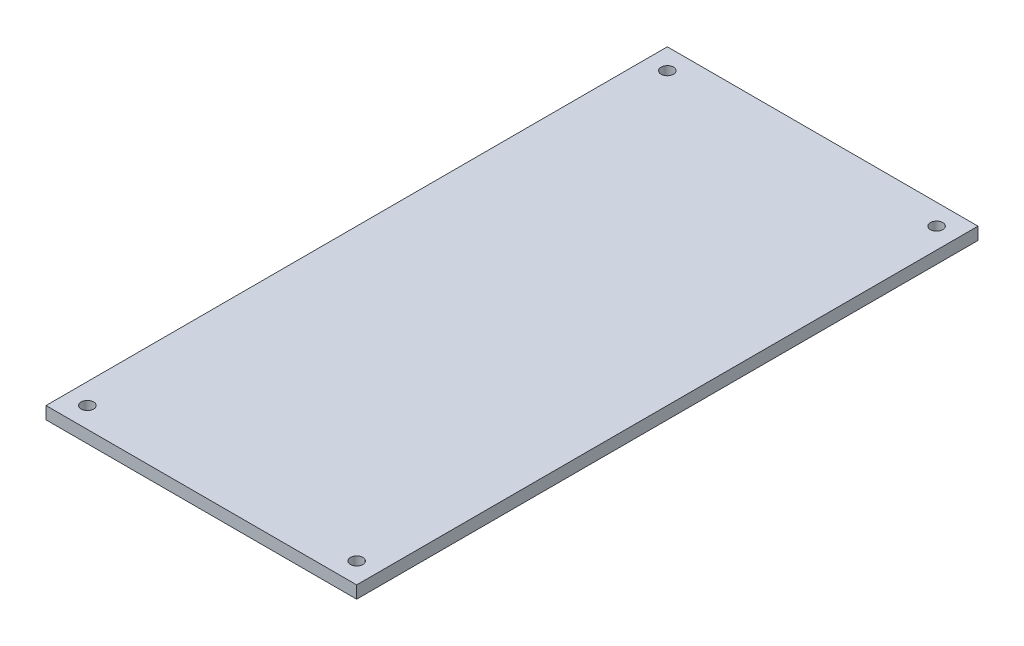
ISO-10303-21;
HEADER;
FILE_DESCRIPTION(('STEP AP214'),'2;1');
FILE_NAME('part.step','',(''),(''),'','','');
FILE_SCHEMA(('AUTOMOTIVE_DESIGN { 1 0 10303 214 1 1 1 1 }'));
ENDSEC;
DATA;
#1=APPLICATION_CONTEXT('core data for automotive mechanical design processes');
#2=APPLICATION_PROTOCOL_DEFINITION('international standard','automotive_design',2000,#1);
#3=PRODUCT_CONTEXT('',#1,'mechanical');
#4=PRODUCT('Part','Part','',(#3));
#5=PRODUCT_RELATED_PRODUCT_CATEGORY('part','',(#4));
#6=PRODUCT_DEFINITION_FORMATION('','',#4);
#7=PRODUCT_DEFINITION_CONTEXT('part definition',#1,'design');
#8=PRODUCT_DEFINITION('design','',#6,#7);
#9=PRODUCT_DEFINITION_SHAPE('','',#8);
#10=(LENGTH_UNIT() NAMED_UNIT(*) SI_UNIT(.MILLI.,.METRE.));
#11=(NAMED_UNIT(*) PLANE_ANGLE_UNIT() SI_UNIT($,.RADIAN.));
#12=(NAMED_UNIT(*) SI_UNIT($,.STERADIAN.) SOLID_ANGLE_UNIT());
#13=UNCERTAINTY_MEASURE_WITH_UNIT(LENGTH_MEASURE(1.E-05),#10,'distance_accuracy_value','');
#14=(GEOMETRIC_REPRESENTATION_CONTEXT(3) GLOBAL_UNCERTAINTY_ASSIGNED_CONTEXT((#13)) GLOBAL_UNIT_ASSIGNED_CONTEXT((#10,
#11,#12)) REPRESENTATION_CONTEXT('',''));
#15=CARTESIAN_POINT('',(0.,0.,0.));
#16=DIRECTION('',(0.,0.,1.));
#17=DIRECTION('',(1.,0.,0.));
#18=AXIS2_PLACEMENT_3D('',#15,#16,#17);
#19=CARTESIAN_POINT('',(25.,3.,-100.));
#20=DIRECTION('',(-1.,0.,0.));
#21=DIRECTION('',(0.,0.,1.));
#22=AXIS2_PLACEMENT_3D('',#19,#20,#21);
#23=PLANE('',#22);
#24=DIRECTION('',(0.,0.,-1.));
#25=VECTOR('',#24,1.);
#26=CARTESIAN_POINT('',(25.,0.,-100.));
#27=LINE('',#26,#25);
#28=CARTESIAN_POINT('',(25.,0.,50.));
#29=VERTEX_POINT('',#28);
#30=CARTESIAN_POINT('',(25.,0.,-100.));
#31=VERTEX_POINT('',#30);
#32=EDGE_CURVE('E104',#29,#31,#27,.T.);
#33=ORIENTED_EDGE('',*,*,#32,.T.);
#34=DIRECTION('',(0.,-1.,0.));
#35=VECTOR('',#34,1.);
#36=CARTESIAN_POINT('',(25.,3.,-100.));
#37=LINE('',#36,#35);
#38=CARTESIAN_POINT('',(25.,3.,-100.));
#39=VERTEX_POINT('',#38);
#40=EDGE_CURVE('E11',#39,#31,#37,.T.);
#41=ORIENTED_EDGE('',*,*,#40,.F.);
#42=DIRECTION('',(0.,0.,-1.));
#43=VECTOR('',#42,1.);
#44=CARTESIAN_POINT('',(25.,3.,-100.));
#45=LINE('',#44,#43);
#46=CARTESIAN_POINT('',(25.,3.,50.));
#47=VERTEX_POINT('',#46);
#48=EDGE_CURVE('E95',#47,#39,#45,.T.);
#49=ORIENTED_EDGE('',*,*,#48,.F.);
#50=DIRECTION('',(0.,-1.,0.));
#51=VECTOR('',#50,1.);
#52=CARTESIAN_POINT('',(25.,3.,50.));
#53=LINE('',#52,#51);
#54=EDGE_CURVE('E101',#47,#29,#53,.T.);
#55=ORIENTED_EDGE('',*,*,#54,.T.);
#56=EDGE_LOOP('',(#33,#41,#49,#55));
#57=FACE_BOUND('',#56,.T.);
#58=ADVANCED_FACE('F39',(#57),#23,.F.);
#59=CARTESIAN_POINT('',(-50.,3.,-100.));
#60=DIRECTION('',(0.,0.,1.));
#61=DIRECTION('',(1.,0.,0.));
#62=AXIS2_PLACEMENT_3D('',#59,#60,#61);
#63=PLANE('',#62);
#64=DIRECTION('',(-1.,0.,0.));
#65=VECTOR('',#64,1.);
#66=CARTESIAN_POINT('',(-50.,0.,-100.));
#67=LINE('',#66,#65);
#68=CARTESIAN_POINT('',(-50.,0.,-100.));
#69=VERTEX_POINT('',#68);
#70=EDGE_CURVE('E96',#31,#69,#67,.T.);
#71=ORIENTED_EDGE('',*,*,#70,.T.);
#72=DIRECTION('',(0.,-1.,0.));
#73=VECTOR('',#72,1.);
#74=CARTESIAN_POINT('',(-50.,3.,-100.));
#75=LINE('',#74,#73);
#76=CARTESIAN_POINT('',(-50.,3.,-100.));
#77=VERTEX_POINT('',#76);
#78=EDGE_CURVE('E48',#77,#69,#75,.T.);
#79=ORIENTED_EDGE('',*,*,#78,.F.);
#80=DIRECTION('',(-1.,0.,0.));
#81=VECTOR('',#80,1.);
#82=CARTESIAN_POINT('',(-50.,3.,-100.));
#83=LINE('',#82,#81);
#84=EDGE_CURVE('E87',#39,#77,#83,.T.);
#85=ORIENTED_EDGE('',*,*,#84,.F.);
#86=ORIENTED_EDGE('',*,*,#40,.T.);
#87=EDGE_LOOP('',(#71,#79,#85,#86));
#88=FACE_BOUND('',#87,.T.);
#89=ADVANCED_FACE('F92',(#88),#63,.F.);
#90=CARTESIAN_POINT('',(-50.,3.,-100.));
#91=DIRECTION('',(1.,0.,0.));
#92=DIRECTION('',(0.,0.,-1.));
#93=AXIS2_PLACEMENT_3D('',#90,#91,#92);
#94=PLANE('',#93);
#95=DIRECTION('',(0.,0.,1.));
#96=VECTOR('',#95,1.);
#97=CARTESIAN_POINT('',(-50.,0.,-100.));
#98=LINE('',#97,#96);
#99=CARTESIAN_POINT('',(-50.,0.,50.));
#100=VERTEX_POINT('',#99);
#101=EDGE_CURVE('E74',#69,#100,#98,.T.);
#102=ORIENTED_EDGE('',*,*,#101,.T.);
#103=DIRECTION('',(0.,-1.,0.));
#104=VECTOR('',#103,1.);
#105=CARTESIAN_POINT('',(-50.,3.,50.));
#106=LINE('',#105,#104);
#107=CARTESIAN_POINT('',(-50.,3.,50.));
#108=VERTEX_POINT('',#107);
#109=EDGE_CURVE('E100',#108,#100,#106,.T.);
#110=ORIENTED_EDGE('',*,*,#109,.F.);
#111=DIRECTION('',(0.,0.,1.));
#112=VECTOR('',#111,1.);
#113=CARTESIAN_POINT('',(-50.,3.,-100.));
#114=LINE('',#113,#112);
#115=EDGE_CURVE('E89',#77,#108,#114,.T.);
#116=ORIENTED_EDGE('',*,*,#115,.F.);
#117=ORIENTED_EDGE('',*,*,#78,.T.);
#118=EDGE_LOOP('',(#102,#110,#116,#117));
#119=FACE_BOUND('',#118,.T.);
#120=ADVANCED_FACE('F97',(#119),#94,.F.);
#121=CARTESIAN_POINT('',(-50.,3.,50.));
#122=DIRECTION('',(0.,0.,-1.));
#123=DIRECTION('',(-1.,0.,0.));
#124=AXIS2_PLACEMENT_3D('',#121,#122,#123);
#125=PLANE('',#124);
#126=DIRECTION('',(1.,0.,0.));
#127=VECTOR('',#126,1.);
#128=CARTESIAN_POINT('',(-50.,0.,50.));
#129=LINE('',#128,#127);
#130=EDGE_CURVE('E79',#100,#29,#129,.T.);
#131=ORIENTED_EDGE('',*,*,#130,.T.);
#132=ORIENTED_EDGE('',*,*,#54,.F.);
#133=DIRECTION('',(1.,0.,0.));
#134=VECTOR('',#133,1.);
#135=CARTESIAN_POINT('',(-50.,3.,50.));
#136=LINE('',#135,#134);
#137=EDGE_CURVE('E60',#108,#47,#136,.T.);
#138=ORIENTED_EDGE('',*,*,#137,.F.);
#139=ORIENTED_EDGE('',*,*,#109,.T.);
#140=EDGE_LOOP('',(#131,#132,#138,#139));
#141=FACE_BOUND('',#140,.T.);
#142=ADVANCED_FACE('F156',(#141),#125,.F.);
#143=CARTESIAN_POINT('',(0.,3.,0.));
#144=DIRECTION('',(0.,1.,0.));
#145=DIRECTION('',(0.,0.,1.));
#146=AXIS2_PLACEMENT_3D('',#143,#144,#145);
#147=PLANE('',#146);
#148=CARTESIAN_POINT('',(-45.,3.,45.));
#149=DIRECTION('',(0.,1.,0.));
#150=DIRECTION('',(0.,0.,1.));
#151=AXIS2_PLACEMENT_3D('',#148,#149,#150);
#152=CIRCLE('',#151,1.5);
#153=CARTESIAN_POINT('',(-45.,3.,46.5));
#154=VERTEX_POINT('',#153);
#155=EDGE_CURVE('E223',#154,#154,#152,.T.);
#156=ORIENTED_EDGE('',*,*,#155,.F.);
#157=EDGE_LOOP('',(#156));
#158=FACE_BOUND('',#157,.T.);
#159=CARTESIAN_POINT('',(20.,3.,45.));
#160=DIRECTION('',(0.,1.,0.));
#161=DIRECTION('',(0.,0.,1.));
#162=AXIS2_PLACEMENT_3D('',#159,#160,#161);
#163=CIRCLE('',#162,1.5);
#164=CARTESIAN_POINT('',(20.,3.,46.5));
#165=VERTEX_POINT('',#164);
#166=EDGE_CURVE('E219',#165,#165,#163,.T.);
#167=ORIENTED_EDGE('',*,*,#166,.F.);
#168=EDGE_LOOP('',(#167));
#169=FACE_BOUND('',#168,.T.);
#170=CARTESIAN_POINT('',(20.,3.,-95.));
#171=DIRECTION('',(0.,1.,0.));
#172=DIRECTION('',(0.,0.,1.));
#173=AXIS2_PLACEMENT_3D('',#170,#171,#172);
#174=CIRCLE('',#173,1.5);
#175=CARTESIAN_POINT('',(20.,3.,-93.5));
#176=VERTEX_POINT('',#175);
#177=EDGE_CURVE('E213',#176,#176,#174,.T.);
#178=ORIENTED_EDGE('',*,*,#177,.F.);
#179=EDGE_LOOP('',(#178));
#180=FACE_BOUND('',#179,.T.);
#181=CARTESIAN_POINT('',(-45.,3.,-95.));
#182=DIRECTION('',(0.,1.,0.));
#183=DIRECTION('',(0.,0.,1.));
#184=AXIS2_PLACEMENT_3D('',#181,#182,#183);
#185=CIRCLE('',#184,1.5);
#186=CARTESIAN_POINT('',(-45.,3.,-93.5));
#187=VERTEX_POINT('',#186);
#188=EDGE_CURVE('E120',#187,#187,#185,.T.);
#189=ORIENTED_EDGE('',*,*,#188,.F.);
#190=EDGE_LOOP('',(#189));
#191=FACE_BOUND('',#190,.T.);
#192=ORIENTED_EDGE('',*,*,#48,.T.);
#193=ORIENTED_EDGE('',*,*,#84,.T.);
#194=ORIENTED_EDGE('',*,*,#115,.T.);
#195=ORIENTED_EDGE('',*,*,#137,.T.);
#196=EDGE_LOOP('',(#192,#193,#194,#195));
#197=FACE_BOUND('',#196,.T.);
#198=ADVANCED_FACE('F86',(#158,#169,#180,#191,#197),#147,.T.);
#199=CARTESIAN_POINT('',(0.,0.,0.));
#200=DIRECTION('',(0.,1.,0.));
#201=DIRECTION('',(0.,0.,1.));
#202=AXIS2_PLACEMENT_3D('',#199,#200,#201);
#203=PLANE('',#202);
#204=CARTESIAN_POINT('',(-45.,0.,45.));
#205=DIRECTION('',(0.,1.,0.));
#206=DIRECTION('',(0.,0.,1.));
#207=AXIS2_PLACEMENT_3D('',#204,#205,#206);
#208=CIRCLE('',#207,1.5);
#209=CARTESIAN_POINT('',(-45.,0.,46.5));
#210=VERTEX_POINT('',#209);
#211=EDGE_CURVE('E45',#210,#210,#208,.T.);
#212=ORIENTED_EDGE('',*,*,#211,.T.);
#213=EDGE_LOOP('',(#212));
#214=FACE_BOUND('',#213,.T.);
#215=CARTESIAN_POINT('',(20.,0.,45.));
#216=DIRECTION('',(0.,1.,0.));
#217=DIRECTION('',(0.,0.,1.));
#218=AXIS2_PLACEMENT_3D('',#215,#216,#217);
#219=CIRCLE('',#218,1.5);
#220=CARTESIAN_POINT('',(20.,0.,46.5));
#221=VERTEX_POINT('',#220);
#222=EDGE_CURVE('E118',#221,#221,#219,.T.);
#223=ORIENTED_EDGE('',*,*,#222,.T.);
#224=EDGE_LOOP('',(#223));
#225=FACE_BOUND('',#224,.T.);
#226=CARTESIAN_POINT('',(20.,0.,-95.));
#227=DIRECTION('',(0.,1.,0.));
#228=DIRECTION('',(0.,0.,1.));
#229=AXIS2_PLACEMENT_3D('',#226,#227,#228);
#230=CIRCLE('',#229,1.5);
#231=CARTESIAN_POINT('',(20.,0.,-93.5));
#232=VERTEX_POINT('',#231);
#233=EDGE_CURVE('E116',#232,#232,#230,.T.);
#234=ORIENTED_EDGE('',*,*,#233,.T.);
#235=EDGE_LOOP('',(#234));
#236=FACE_BOUND('',#235,.T.);
#237=CARTESIAN_POINT('',(-45.,0.,-95.));
#238=DIRECTION('',(0.,1.,0.));
#239=DIRECTION('',(0.,0.,1.));
#240=AXIS2_PLACEMENT_3D('',#237,#238,#239);
#241=CIRCLE('',#240,1.5);
#242=CARTESIAN_POINT('',(-45.,0.,-93.5));
#243=VERTEX_POINT('',#242);
#244=EDGE_CURVE('E114',#243,#243,#241,.T.);
#245=ORIENTED_EDGE('',*,*,#244,.T.);
#246=EDGE_LOOP('',(#245));
#247=FACE_BOUND('',#246,.T.);
#248=ORIENTED_EDGE('',*,*,#32,.F.);
#249=ORIENTED_EDGE('',*,*,#130,.F.);
#250=ORIENTED_EDGE('',*,*,#101,.F.);
#251=ORIENTED_EDGE('',*,*,#70,.F.);
#252=EDGE_LOOP('',(#248,#249,#250,#251));
#253=FACE_BOUND('',#252,.T.);
#254=ADVANCED_FACE('F127',(#214,#225,#236,#247,#253),#203,.F.);
#255=CARTESIAN_POINT('',(-45.,-17.,-95.));
#256=DIRECTION('',(0.,1.,0.));
#257=DIRECTION('',(0.,0.,1.));
#258=AXIS2_PLACEMENT_3D('',#255,#256,#257);
#259=CYLINDRICAL_SURFACE('',#258,1.5);
#260=ORIENTED_EDGE('',*,*,#188,.T.);
#261=EDGE_LOOP('',(#260));
#262=FACE_BOUND('',#261,.T.);
#263=ORIENTED_EDGE('',*,*,#244,.F.);
#264=EDGE_LOOP('',(#263));
#265=FACE_BOUND('',#264,.T.);
#266=ADVANCED_FACE('F149',(#262,#265),#259,.F.);
#267=CARTESIAN_POINT('',(20.,-17.,-95.));
#268=DIRECTION('',(0.,1.,0.));
#269=DIRECTION('',(0.,0.,1.));
#270=AXIS2_PLACEMENT_3D('',#267,#268,#269);
#271=CYLINDRICAL_SURFACE('',#270,1.5);
#272=ORIENTED_EDGE('',*,*,#177,.T.);
#273=EDGE_LOOP('',(#272));
#274=FACE_BOUND('',#273,.T.);
#275=ORIENTED_EDGE('',*,*,#233,.F.);
#276=EDGE_LOOP('',(#275));
#277=FACE_BOUND('',#276,.T.);
#278=ADVANCED_FACE('F138',(#274,#277),#271,.F.);
#279=CARTESIAN_POINT('',(20.,-17.,45.));
#280=DIRECTION('',(0.,1.,0.));
#281=DIRECTION('',(0.,0.,1.));
#282=AXIS2_PLACEMENT_3D('',#279,#280,#281);
#283=CYLINDRICAL_SURFACE('',#282,1.5);
#284=ORIENTED_EDGE('',*,*,#166,.T.);
#285=EDGE_LOOP('',(#284));
#286=FACE_BOUND('',#285,.T.);
#287=ORIENTED_EDGE('',*,*,#222,.F.);
#288=EDGE_LOOP('',(#287));
#289=FACE_BOUND('',#288,.T.);
#290=ADVANCED_FACE('F128',(#286,#289),#283,.F.);
#291=CARTESIAN_POINT('',(-45.,-17.,45.));
#292=DIRECTION('',(0.,1.,0.));
#293=DIRECTION('',(0.,0.,1.));
#294=AXIS2_PLACEMENT_3D('',#291,#292,#293);
#295=CYLINDRICAL_SURFACE('',#294,1.5);
#296=ORIENTED_EDGE('',*,*,#155,.T.);
#297=EDGE_LOOP('',(#296));
#298=FACE_BOUND('',#297,.T.);
#299=ORIENTED_EDGE('',*,*,#211,.F.);
#300=EDGE_LOOP('',(#299));
#301=FACE_BOUND('',#300,.T.);
#302=ADVANCED_FACE('F126',(#298,#301),#295,.F.);
#303=CLOSED_SHELL('',(#58,#89,#120,#142,#198,#254,#266,#278,#290,#302));
#304=MANIFOLD_SOLID_BREP('B2',#303);
#305=ADVANCED_BREP_SHAPE_REPRESENTATION('',(#18,#304),#14);
#306=SHAPE_DEFINITION_REPRESENTATION(#9,#305);
ENDSEC;
END-ISO-10303-21;
